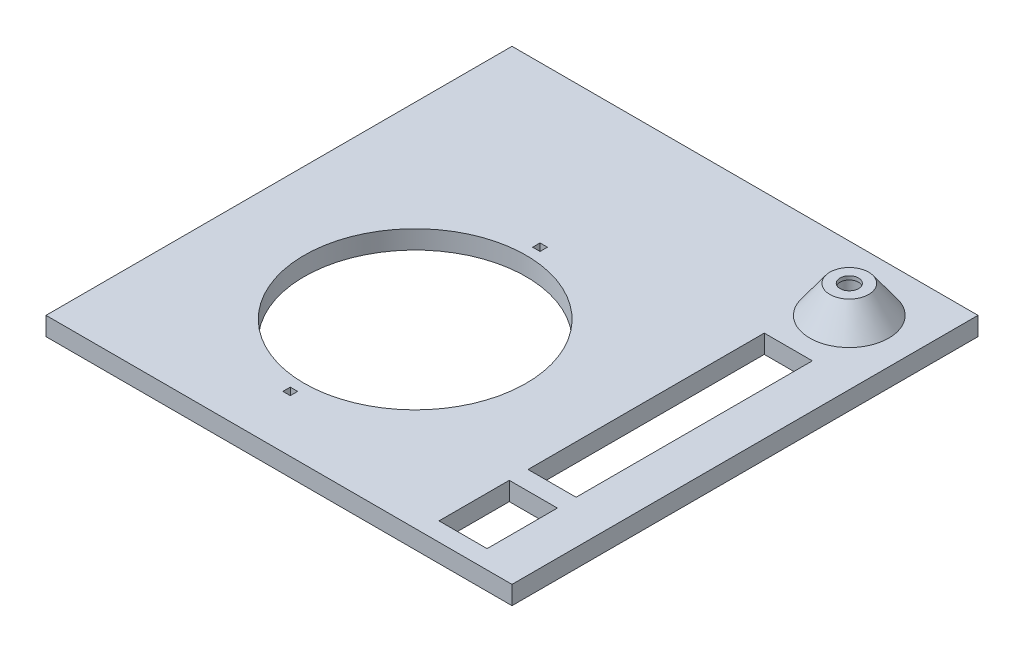
ISO-10303-21;
HEADER;
FILE_DESCRIPTION(('STEP AP214'),'2;1');
FILE_NAME('part.step','',(''),(''),'','','');
FILE_SCHEMA(('AUTOMOTIVE_DESIGN { 1 0 10303 214 1 1 1 1 }'));
ENDSEC;
DATA;
#1=APPLICATION_CONTEXT('core data for automotive mechanical design processes');
#2=APPLICATION_PROTOCOL_DEFINITION('international standard','automotive_design',2000,#1);
#3=PRODUCT_CONTEXT('',#1,'mechanical');
#4=PRODUCT('Part','Part','',(#3));
#5=PRODUCT_RELATED_PRODUCT_CATEGORY('part','',(#4));
#6=PRODUCT_DEFINITION_FORMATION('','',#4);
#7=PRODUCT_DEFINITION_CONTEXT('part definition',#1,'design');
#8=PRODUCT_DEFINITION('design','',#6,#7);
#9=PRODUCT_DEFINITION_SHAPE('','',#8);
#10=(LENGTH_UNIT() NAMED_UNIT(*) SI_UNIT(.MILLI.,.METRE.));
#11=(NAMED_UNIT(*) PLANE_ANGLE_UNIT() SI_UNIT($,.RADIAN.));
#12=(NAMED_UNIT(*) SI_UNIT($,.STERADIAN.) SOLID_ANGLE_UNIT());
#13=UNCERTAINTY_MEASURE_WITH_UNIT(LENGTH_MEASURE(1.E-05),#10,'distance_accuracy_value','');
#14=(GEOMETRIC_REPRESENTATION_CONTEXT(3) GLOBAL_UNCERTAINTY_ASSIGNED_CONTEXT((#13)) GLOBAL_UNIT_ASSIGNED_CONTEXT((#10,
#11,#12)) REPRESENTATION_CONTEXT('',''));
#15=CARTESIAN_POINT('',(0.,0.,0.));
#16=DIRECTION('',(0.,0.,1.));
#17=DIRECTION('',(1.,0.,0.));
#18=AXIS2_PLACEMENT_3D('',#15,#16,#17);
#19=CARTESIAN_POINT('',(0.,5.,0.));
#20=DIRECTION('',(0.,-1.,0.));
#21=DIRECTION('',(0.,0.,-1.));
#22=AXIS2_PLACEMENT_3D('',#19,#20,#21);
#23=PLANE('',#22);
#24=DIRECTION('',(1.,0.,0.));
#25=VECTOR('',#24,1.);
#26=CARTESIAN_POINT('',(51.8371550320844,5.,-81.7384677373599));
#27=LINE('',#26,#25);
#28=CARTESIAN_POINT('',(49.8371550320844,5.,-81.7384677373599));
#29=VERTEX_POINT('',#28);
#30=CARTESIAN_POINT('',(51.8371550320844,5.,-81.7384677373599));
#31=VERTEX_POINT('',#30);
#32=EDGE_CURVE('E207',#29,#31,#27,.T.);
#33=ORIENTED_EDGE('',*,*,#32,.F.);
#34=DIRECTION('',(0.,0.,1.));
#35=VECTOR('',#34,1.);
#36=CARTESIAN_POINT('',(49.8371550320844,5.,-83.7384677373599));
#37=LINE('',#36,#35);
#38=CARTESIAN_POINT('',(49.8371550320844,5.,-83.7384677373599));
#39=VERTEX_POINT('',#38);
#40=EDGE_CURVE('E56',#39,#29,#37,.T.);
#41=ORIENTED_EDGE('',*,*,#40,.F.);
#42=DIRECTION('',(-1.,0.,0.));
#43=VECTOR('',#42,1.);
#44=CARTESIAN_POINT('',(51.8371550320844,5.,-83.7384677373599));
#45=LINE('',#44,#43);
#46=CARTESIAN_POINT('',(51.8371550320844,5.,-83.7384677373599));
#47=VERTEX_POINT('',#46);
#48=EDGE_CURVE('E198',#47,#39,#45,.T.);
#49=ORIENTED_EDGE('',*,*,#48,.F.);
#50=DIRECTION('',(0.,0.,-1.));
#51=VECTOR('',#50,1.);
#52=CARTESIAN_POINT('',(51.8371550320844,5.,-83.7384677373599));
#53=LINE('',#52,#51);
#54=EDGE_CURVE('E201',#31,#47,#53,.T.);
#55=ORIENTED_EDGE('',*,*,#54,.F.);
#56=EDGE_LOOP('',(#33,#41,#49,#55));
#57=FACE_BOUND('',#56,.T.);
#58=DIRECTION('',(1.,0.,0.));
#59=VECTOR('',#58,1.);
#60=CARTESIAN_POINT('',(51.8371550320844,5.,-14.2107002400342));
#61=LINE('',#60,#59);
#62=CARTESIAN_POINT('',(49.8371550320844,5.,-14.2107002400342));
#63=VERTEX_POINT('',#62);
#64=CARTESIAN_POINT('',(51.8371550320844,5.,-14.2107002400342));
#65=VERTEX_POINT('',#64);
#66=EDGE_CURVE('E233',#63,#65,#61,.T.);
#67=ORIENTED_EDGE('',*,*,#66,.F.);
#68=DIRECTION('',(0.,0.,1.));
#69=VECTOR('',#68,1.);
#70=CARTESIAN_POINT('',(49.8371550320844,5.,-14.2107002400342));
#71=LINE('',#70,#69);
#72=CARTESIAN_POINT('',(49.8371550320844,5.,-16.2107002400342));
#73=VERTEX_POINT('',#72);
#74=EDGE_CURVE('E64',#73,#63,#71,.T.);
#75=ORIENTED_EDGE('',*,*,#74,.F.);
#76=DIRECTION('',(-1.,0.,0.));
#77=VECTOR('',#76,1.);
#78=CARTESIAN_POINT('',(51.8371550320844,5.,-16.2107002400342));
#79=LINE('',#78,#77);
#80=CARTESIAN_POINT('',(51.8371550320844,5.,-16.2107002400342));
#81=VERTEX_POINT('',#80);
#82=EDGE_CURVE('E222',#81,#73,#79,.T.);
#83=ORIENTED_EDGE('',*,*,#82,.F.);
#84=DIRECTION('',(0.,0.,-1.));
#85=VECTOR('',#84,1.);
#86=CARTESIAN_POINT('',(51.8371550320844,5.,-14.2107002400342));
#87=LINE('',#86,#85);
#88=EDGE_CURVE('E236',#65,#81,#87,.T.);
#89=ORIENTED_EDGE('',*,*,#88,.F.);
#90=EDGE_LOOP('',(#67,#75,#83,#89));
#91=FACE_BOUND('',#90,.T.);
#92=CARTESIAN_POINT('',(50.8371550320844,5.,-48.9745839886971));
#93=DIRECTION('',(0.,1.,0.));
#94=DIRECTION('',(0.,0.,1.));
#95=AXIS2_PLACEMENT_3D('',#92,#93,#94);
#96=CIRCLE('',#95,30.);
#97=CARTESIAN_POINT('',(50.8371550320844,5.,-18.9745839886971));
#98=VERTEX_POINT('',#97);
#99=EDGE_CURVE('E214',#98,#98,#96,.T.);
#100=ORIENTED_EDGE('',*,*,#99,.F.);
#101=EDGE_LOOP('',(#100));
#102=FACE_BOUND('',#101,.T.);
#103=DIRECTION('',(0.,0.,1.));
#104=VECTOR('',#103,1.);
#105=CARTESIAN_POINT('',(0.,5.,0.));
#106=LINE('',#105,#104);
#107=CARTESIAN_POINT('',(0.,5.,-126.));
#108=VERTEX_POINT('',#107);
#109=CARTESIAN_POINT('',(0.,5.,0.));
#110=VERTEX_POINT('',#109);
#111=EDGE_CURVE('E325',#108,#110,#106,.T.);
#112=ORIENTED_EDGE('',*,*,#111,.T.);
#113=DIRECTION('',(1.,0.,0.));
#114=VECTOR('',#113,1.);
#115=CARTESIAN_POINT('',(0.,5.,0.));
#116=LINE('',#115,#114);
#117=CARTESIAN_POINT('',(126.,5.,0.));
#118=VERTEX_POINT('',#117);
#119=EDGE_CURVE('E328',#110,#118,#116,.T.);
#120=ORIENTED_EDGE('',*,*,#119,.T.);
#121=DIRECTION('',(0.,0.,-1.));
#122=VECTOR('',#121,1.);
#123=CARTESIAN_POINT('',(126.,5.,0.));
#124=LINE('',#123,#122);
#125=CARTESIAN_POINT('',(126.,5.,-126.));
#126=VERTEX_POINT('',#125);
#127=EDGE_CURVE('E331',#118,#126,#124,.T.);
#128=ORIENTED_EDGE('',*,*,#127,.T.);
#129=DIRECTION('',(-1.,0.,0.));
#130=VECTOR('',#129,1.);
#131=CARTESIAN_POINT('',(0.,5.,-126.));
#132=LINE('',#131,#130);
#133=EDGE_CURVE('E333',#126,#108,#132,.T.);
#134=ORIENTED_EDGE('',*,*,#133,.T.);
#135=EDGE_LOOP('',(#112,#120,#128,#134));
#136=FACE_BOUND('',#135,.T.);
#137=CARTESIAN_POINT('',(108.6,5.,-108.6));
#138=DIRECTION('',(0.,-1.,0.));
#139=DIRECTION('',(0.,0.,-1.));
#140=AXIS2_PLACEMENT_3D('',#137,#138,#139);
#141=CIRCLE('',#140,10.6836436799865);
#142=CARTESIAN_POINT('',(108.6,5.,-119.283643679987));
#143=VERTEX_POINT('',#142);
#144=EDGE_CURVE('E11',#143,#143,#141,.T.);
#145=ORIENTED_EDGE('',*,*,#144,.T.);
#146=EDGE_LOOP('',(#145));
#147=FACE_BOUND('',#146,.T.);
#148=DIRECTION('',(0.,0.,1.));
#149=VECTOR('',#148,1.);
#150=CARTESIAN_POINT('',(101.263328315795,5.,0.));
#151=LINE('',#150,#149);
#152=CARTESIAN_POINT('',(101.263328315795,5.,-24.));
#153=VERTEX_POINT('',#152);
#154=CARTESIAN_POINT('',(101.263328315795,5.,-5.));
#155=VERTEX_POINT('',#154);
#156=EDGE_CURVE('E300',#153,#155,#151,.T.);
#157=ORIENTED_EDGE('',*,*,#156,.F.);
#158=DIRECTION('',(-1.,0.,0.));
#159=VECTOR('',#158,1.);
#160=CARTESIAN_POINT('',(0.,5.,-24.));
#161=LINE('',#160,#159);
#162=CARTESIAN_POINT('',(114.263328315795,5.,-24.));
#163=VERTEX_POINT('',#162);
#164=EDGE_CURVE('E250',#163,#153,#161,.T.);
#165=ORIENTED_EDGE('',*,*,#164,.F.);
#166=DIRECTION('',(0.,0.,1.));
#167=VECTOR('',#166,1.);
#168=CARTESIAN_POINT('',(114.263328315795,5.,0.));
#169=LINE('',#168,#167);
#170=CARTESIAN_POINT('',(114.263328315795,5.,-5.));
#171=VERTEX_POINT('',#170);
#172=EDGE_CURVE('E290',#163,#171,#169,.T.);
#173=ORIENTED_EDGE('',*,*,#172,.T.);
#174=DIRECTION('',(-1.,0.,0.));
#175=VECTOR('',#174,1.);
#176=CARTESIAN_POINT('',(0.,5.,-4.99999999999999));
#177=LINE('',#176,#175);
#178=EDGE_CURVE('E303',#171,#155,#177,.T.);
#179=ORIENTED_EDGE('',*,*,#178,.T.);
#180=EDGE_LOOP('',(#157,#165,#173,#179));
#181=FACE_BOUND('',#180,.T.);
#182=DIRECTION('',(0.,0.,-1.));
#183=VECTOR('',#182,1.);
#184=CARTESIAN_POINT('',(101.263328315795,5.,0.));
#185=LINE('',#184,#183);
#186=CARTESIAN_POINT('',(101.263328315795,5.,-29.06949502318));
#187=VERTEX_POINT('',#186);
#188=CARTESIAN_POINT('',(101.263328315795,5.,-92.9491679773942));
#189=VERTEX_POINT('',#188);
#190=EDGE_CURVE('E265',#187,#189,#185,.T.);
#191=ORIENTED_EDGE('',*,*,#190,.T.);
#192=DIRECTION('',(-1.,0.,0.));
#193=VECTOR('',#192,1.);
#194=CARTESIAN_POINT('',(0.,5.,-92.9491679773942));
#195=LINE('',#194,#193);
#196=CARTESIAN_POINT('',(114.263328315795,5.,-92.9491679773942));
#197=VERTEX_POINT('',#196);
#198=EDGE_CURVE('E256',#197,#189,#195,.T.);
#199=ORIENTED_EDGE('',*,*,#198,.F.);
#200=DIRECTION('',(0.,0.,-1.));
#201=VECTOR('',#200,1.);
#202=CARTESIAN_POINT('',(114.263328315795,5.,0.));
#203=LINE('',#202,#201);
#204=CARTESIAN_POINT('',(114.263328315795,5.,-29.06949502318));
#205=VERTEX_POINT('',#204);
#206=EDGE_CURVE('E272',#205,#197,#203,.T.);
#207=ORIENTED_EDGE('',*,*,#206,.F.);
#208=DIRECTION('',(-1.,0.,0.));
#209=VECTOR('',#208,1.);
#210=CARTESIAN_POINT('',(0.,5.,-29.06949502318));
#211=LINE('',#210,#209);
#212=EDGE_CURVE('E268',#205,#187,#211,.T.);
#213=ORIENTED_EDGE('',*,*,#212,.T.);
#214=EDGE_LOOP('',(#191,#199,#207,#213));
#215=FACE_BOUND('',#214,.T.);
#216=ADVANCED_FACE('F40',(#57,#91,#102,#136,#147,#181,#215),#23,.F.);
#217=CARTESIAN_POINT('',(0.,0.,0.));
#218=DIRECTION('',(0.,-1.,0.));
#219=DIRECTION('',(0.,0.,-1.));
#220=AXIS2_PLACEMENT_3D('',#217,#218,#219);
#221=PLANE('',#220);
#222=CARTESIAN_POINT('',(50.8371550320844,0.,-48.9745839886971));
#223=DIRECTION('',(0.,1.,0.));
#224=DIRECTION('',(0.,0.,1.));
#225=AXIS2_PLACEMENT_3D('',#222,#223,#224);
#226=CIRCLE('',#225,30.);
#227=CARTESIAN_POINT('',(50.8371550320844,0.,-18.9745839886971));
#228=VERTEX_POINT('',#227);
#229=EDGE_CURVE('E247',#228,#228,#226,.T.);
#230=ORIENTED_EDGE('',*,*,#229,.T.);
#231=EDGE_LOOP('',(#230));
#232=FACE_BOUND('',#231,.T.);
#233=DIRECTION('',(-1.,0.,0.));
#234=VECTOR('',#233,1.);
#235=CARTESIAN_POINT('',(0.,0.,-24.));
#236=LINE('',#235,#234);
#237=CARTESIAN_POINT('',(114.263328315795,0.,-24.));
#238=VERTEX_POINT('',#237);
#239=CARTESIAN_POINT('',(101.263328315795,0.,-24.));
#240=VERTEX_POINT('',#239);
#241=EDGE_CURVE('E286',#238,#240,#236,.T.);
#242=ORIENTED_EDGE('',*,*,#241,.T.);
#243=DIRECTION('',(0.,0.,1.));
#244=VECTOR('',#243,1.);
#245=CARTESIAN_POINT('',(101.263328315795,0.,0.));
#246=LINE('',#245,#244);
#247=CARTESIAN_POINT('',(101.263328315795,0.,-5.));
#248=VERTEX_POINT('',#247);
#249=EDGE_CURVE('E289',#240,#248,#246,.T.);
#250=ORIENTED_EDGE('',*,*,#249,.T.);
#251=DIRECTION('',(-1.,0.,0.));
#252=VECTOR('',#251,1.);
#253=CARTESIAN_POINT('',(0.,0.,-4.99999999999999));
#254=LINE('',#253,#252);
#255=CARTESIAN_POINT('',(114.263328315795,0.,-5.));
#256=VERTEX_POINT('',#255);
#257=EDGE_CURVE('E293',#256,#248,#254,.T.);
#258=ORIENTED_EDGE('',*,*,#257,.F.);
#259=DIRECTION('',(0.,0.,1.));
#260=VECTOR('',#259,1.);
#261=CARTESIAN_POINT('',(114.263328315795,0.,0.));
#262=LINE('',#261,#260);
#263=EDGE_CURVE('E296',#238,#256,#262,.T.);
#264=ORIENTED_EDGE('',*,*,#263,.F.);
#265=EDGE_LOOP('',(#242,#250,#258,#264));
#266=FACE_BOUND('',#265,.T.);
#267=CARTESIAN_POINT('',(108.6,0.,-108.6));
#268=DIRECTION('',(0.,-1.,0.));
#269=DIRECTION('',(0.,0.,-1.));
#270=AXIS2_PLACEMENT_3D('',#267,#268,#269);
#271=CIRCLE('',#270,2.95);
#272=CARTESIAN_POINT('',(108.6,0.,-111.55));
#273=VERTEX_POINT('',#272);
#274=EDGE_CURVE('E322',#273,#273,#271,.T.);
#275=ORIENTED_EDGE('',*,*,#274,.F.);
#276=EDGE_LOOP('',(#275));
#277=FACE_BOUND('',#276,.T.);
#278=DIRECTION('',(0.,0.,1.));
#279=VECTOR('',#278,1.);
#280=CARTESIAN_POINT('',(0.,0.,0.));
#281=LINE('',#280,#279);
#282=CARTESIAN_POINT('',(0.,0.,-126.));
#283=VERTEX_POINT('',#282);
#284=CARTESIAN_POINT('',(0.,0.,0.));
#285=VERTEX_POINT('',#284);
#286=EDGE_CURVE('E321',#283,#285,#281,.T.);
#287=ORIENTED_EDGE('',*,*,#286,.F.);
#288=DIRECTION('',(-1.,0.,0.));
#289=VECTOR('',#288,1.);
#290=CARTESIAN_POINT('',(0.,0.,-126.));
#291=LINE('',#290,#289);
#292=CARTESIAN_POINT('',(126.,0.,-126.));
#293=VERTEX_POINT('',#292);
#294=EDGE_CURVE('E329',#293,#283,#291,.T.);
#295=ORIENTED_EDGE('',*,*,#294,.F.);
#296=DIRECTION('',(0.,0.,-1.));
#297=VECTOR('',#296,1.);
#298=CARTESIAN_POINT('',(126.,0.,0.));
#299=LINE('',#298,#297);
#300=CARTESIAN_POINT('',(126.,0.,0.));
#301=VERTEX_POINT('',#300);
#302=EDGE_CURVE('E340',#301,#293,#299,.T.);
#303=ORIENTED_EDGE('',*,*,#302,.F.);
#304=DIRECTION('',(1.,0.,0.));
#305=VECTOR('',#304,1.);
#306=CARTESIAN_POINT('',(0.,0.,0.));
#307=LINE('',#306,#305);
#308=EDGE_CURVE('E338',#285,#301,#307,.T.);
#309=ORIENTED_EDGE('',*,*,#308,.F.);
#310=EDGE_LOOP('',(#287,#295,#303,#309));
#311=FACE_BOUND('',#310,.T.);
#312=DIRECTION('',(-1.,0.,0.));
#313=VECTOR('',#312,1.);
#314=CARTESIAN_POINT('',(0.,0.,-92.9491679773942));
#315=LINE('',#314,#313);
#316=CARTESIAN_POINT('',(114.263328315795,0.,-92.9491679773942));
#317=VERTEX_POINT('',#316);
#318=CARTESIAN_POINT('',(101.263328315795,0.,-92.9491679773942));
#319=VERTEX_POINT('',#318);
#320=EDGE_CURVE('E261',#317,#319,#315,.T.);
#321=ORIENTED_EDGE('',*,*,#320,.T.);
#322=DIRECTION('',(0.,0.,-1.));
#323=VECTOR('',#322,1.);
#324=CARTESIAN_POINT('',(101.263328315795,0.,0.));
#325=LINE('',#324,#323);
#326=CARTESIAN_POINT('',(101.263328315795,0.,-29.06949502318));
#327=VERTEX_POINT('',#326);
#328=EDGE_CURVE('E253',#327,#319,#325,.T.);
#329=ORIENTED_EDGE('',*,*,#328,.F.);
#330=DIRECTION('',(-1.,0.,0.));
#331=VECTOR('',#330,1.);
#332=CARTESIAN_POINT('',(0.,0.,-29.06949502318));
#333=LINE('',#332,#331);
#334=CARTESIAN_POINT('',(114.263328315795,0.,-29.06949502318));
#335=VERTEX_POINT('',#334);
#336=EDGE_CURVE('E255',#335,#327,#333,.T.);
#337=ORIENTED_EDGE('',*,*,#336,.F.);
#338=DIRECTION('',(0.,0.,-1.));
#339=VECTOR('',#338,1.);
#340=CARTESIAN_POINT('',(114.263328315795,0.,0.));
#341=LINE('',#340,#339);
#342=EDGE_CURVE('E258',#335,#317,#341,.T.);
#343=ORIENTED_EDGE('',*,*,#342,.T.);
#344=EDGE_LOOP('',(#321,#329,#337,#343));
#345=FACE_BOUND('',#344,.T.);
#346=ADVANCED_FACE('F378',(#232,#266,#277,#311,#345),#221,.T.);
#347=CARTESIAN_POINT('',(0.,5.,0.));
#348=DIRECTION('',(1.,0.,0.));
#349=DIRECTION('',(0.,0.,-1.));
#350=AXIS2_PLACEMENT_3D('',#347,#348,#349);
#351=PLANE('',#350);
#352=ORIENTED_EDGE('',*,*,#286,.T.);
#353=DIRECTION('',(0.,-1.,0.));
#354=VECTOR('',#353,1.);
#355=CARTESIAN_POINT('',(0.,5.,0.));
#356=LINE('',#355,#354);
#357=EDGE_CURVE('E351',#110,#285,#356,.T.);
#358=ORIENTED_EDGE('',*,*,#357,.F.);
#359=ORIENTED_EDGE('',*,*,#111,.F.);
#360=DIRECTION('',(0.,-1.,0.));
#361=VECTOR('',#360,1.);
#362=CARTESIAN_POINT('',(0.,5.,-126.));
#363=LINE('',#362,#361);
#364=EDGE_CURVE('E335',#108,#283,#363,.T.);
#365=ORIENTED_EDGE('',*,*,#364,.T.);
#366=EDGE_LOOP('',(#352,#358,#359,#365));
#367=FACE_BOUND('',#366,.T.);
#368=ADVANCED_FACE('F386',(#367),#351,.F.);
#369=CARTESIAN_POINT('',(0.,5.,0.));
#370=DIRECTION('',(0.,0.,-1.));
#371=DIRECTION('',(-1.,0.,0.));
#372=AXIS2_PLACEMENT_3D('',#369,#370,#371);
#373=PLANE('',#372);
#374=ORIENTED_EDGE('',*,*,#308,.T.);
#375=DIRECTION('',(0.,-1.,0.));
#376=VECTOR('',#375,1.);
#377=CARTESIAN_POINT('',(126.,5.,0.));
#378=LINE('',#377,#376);
#379=EDGE_CURVE('E348',#118,#301,#378,.T.);
#380=ORIENTED_EDGE('',*,*,#379,.F.);
#381=ORIENTED_EDGE('',*,*,#119,.F.);
#382=ORIENTED_EDGE('',*,*,#357,.T.);
#383=EDGE_LOOP('',(#374,#380,#381,#382));
#384=FACE_BOUND('',#383,.T.);
#385=ADVANCED_FACE('F400',(#384),#373,.F.);
#386=CARTESIAN_POINT('',(126.,5.,0.));
#387=DIRECTION('',(-1.,0.,0.));
#388=DIRECTION('',(0.,0.,1.));
#389=AXIS2_PLACEMENT_3D('',#386,#387,#388);
#390=PLANE('',#389);
#391=ORIENTED_EDGE('',*,*,#302,.T.);
#392=DIRECTION('',(0.,-1.,0.));
#393=VECTOR('',#392,1.);
#394=CARTESIAN_POINT('',(126.,5.,-126.));
#395=LINE('',#394,#393);
#396=EDGE_CURVE('E345',#126,#293,#395,.T.);
#397=ORIENTED_EDGE('',*,*,#396,.F.);
#398=ORIENTED_EDGE('',*,*,#127,.F.);
#399=ORIENTED_EDGE('',*,*,#379,.T.);
#400=EDGE_LOOP('',(#391,#397,#398,#399));
#401=FACE_BOUND('',#400,.T.);
#402=ADVANCED_FACE('F396',(#401),#390,.F.);
#403=CARTESIAN_POINT('',(0.,5.,-126.));
#404=DIRECTION('',(0.,0.,1.));
#405=DIRECTION('',(1.,0.,0.));
#406=AXIS2_PLACEMENT_3D('',#403,#404,#405);
#407=PLANE('',#406);
#408=ORIENTED_EDGE('',*,*,#294,.T.);
#409=ORIENTED_EDGE('',*,*,#364,.F.);
#410=ORIENTED_EDGE('',*,*,#133,.F.);
#411=ORIENTED_EDGE('',*,*,#396,.T.);
#412=EDGE_LOOP('',(#408,#409,#410,#411));
#413=FACE_BOUND('',#412,.T.);
#414=ADVANCED_FACE('F393',(#413),#407,.F.);
#415=CARTESIAN_POINT('',(108.6,12.5,-108.6));
#416=DIRECTION('',(0.,1.,0.));
#417=DIRECTION('',(0.,0.,1.));
#418=AXIS2_PLACEMENT_3D('',#415,#416,#417);
#419=PLANE('',#418);
#420=CARTESIAN_POINT('',(108.6,12.5,-108.6));
#421=DIRECTION('',(0.,1.,0.));
#422=DIRECTION('',(0.,0.,1.));
#423=AXIS2_PLACEMENT_3D('',#420,#421,#422);
#424=CIRCLE('',#423,5.23457471994626);
#425=CARTESIAN_POINT('',(108.6,12.5,-113.834574719946));
#426=VERTEX_POINT('',#425);
#427=EDGE_CURVE('E49',#426,#426,#424,.T.);
#428=ORIENTED_EDGE('',*,*,#427,.T.);
#429=EDGE_LOOP('',(#428));
#430=FACE_BOUND('',#429,.T.);
#431=CARTESIAN_POINT('',(108.6,12.5,-108.6));
#432=DIRECTION('',(0.,1.,0.));
#433=DIRECTION('',(0.,0.,1.));
#434=AXIS2_PLACEMENT_3D('',#431,#432,#433);
#435=CIRCLE('',#434,2.5);
#436=CARTESIAN_POINT('',(108.6,12.5,-106.1));
#437=VERTEX_POINT('',#436);
#438=EDGE_CURVE('E279',#437,#437,#435,.T.);
#439=ORIENTED_EDGE('',*,*,#438,.F.);
#440=EDGE_LOOP('',(#439));
#441=FACE_BOUND('',#440,.T.);
#442=ADVANCED_FACE('F358',(#430,#441),#419,.T.);
#443=CARTESIAN_POINT('',(108.6,11.5,-108.6));
#444=DIRECTION('',(0.,-1.,0.));
#445=DIRECTION('',(0.,0.,-1.));
#446=AXIS2_PLACEMENT_3D('',#443,#444,#445);
#447=CYLINDRICAL_SURFACE('',#446,2.95);
#448=CARTESIAN_POINT('',(108.6,11.5,-108.6));
#449=DIRECTION('',(0.,-1.,0.));
#450=DIRECTION('',(0.,0.,-1.));
#451=AXIS2_PLACEMENT_3D('',#448,#449,#450);
#452=CIRCLE('',#451,2.95);
#453=CARTESIAN_POINT('',(108.6,11.5,-111.55));
#454=VERTEX_POINT('',#453);
#455=EDGE_CURVE('E318',#454,#454,#452,.T.);
#456=ORIENTED_EDGE('',*,*,#455,.F.);
#457=EDGE_LOOP('',(#456));
#458=FACE_BOUND('',#457,.T.);
#459=ORIENTED_EDGE('',*,*,#274,.T.);
#460=EDGE_LOOP('',(#459));
#461=FACE_BOUND('',#460,.T.);
#462=ADVANCED_FACE('F468',(#458,#461),#447,.F.);
#463=CARTESIAN_POINT('',(108.6,11.5,-108.6));
#464=DIRECTION('',(0.,-1.,0.));
#465=DIRECTION('',(0.,0.,-1.));
#466=AXIS2_PLACEMENT_3D('',#463,#464,#465);
#467=PLANE('',#466);
#468=CARTESIAN_POINT('',(108.6,11.5,-108.6));
#469=DIRECTION('',(0.,-1.,0.));
#470=DIRECTION('',(0.,0.,-1.));
#471=AXIS2_PLACEMENT_3D('',#468,#469,#470);
#472=CIRCLE('',#471,2.5);
#473=CARTESIAN_POINT('',(108.6,11.5,-111.1));
#474=VERTEX_POINT('',#473);
#475=EDGE_CURVE('E317',#474,#474,#472,.T.);
#476=ORIENTED_EDGE('',*,*,#475,.F.);
#477=EDGE_LOOP('',(#476));
#478=FACE_BOUND('',#477,.T.);
#479=ORIENTED_EDGE('',*,*,#455,.T.);
#480=EDGE_LOOP('',(#479));
#481=FACE_BOUND('',#480,.T.);
#482=ADVANCED_FACE('F373',(#478,#481),#467,.T.);
#483=CARTESIAN_POINT('',(108.6,0.,-108.6));
#484=DIRECTION('',(0.,1.,0.));
#485=DIRECTION('',(0.,0.,1.));
#486=AXIS2_PLACEMENT_3D('',#483,#484,#485);
#487=CYLINDRICAL_SURFACE('',#486,2.5);
#488=ORIENTED_EDGE('',*,*,#475,.T.);
#489=EDGE_LOOP('',(#488));
#490=FACE_BOUND('',#489,.T.);
#491=ORIENTED_EDGE('',*,*,#438,.T.);
#492=EDGE_LOOP('',(#491));
#493=FACE_BOUND('',#492,.T.);
#494=ADVANCED_FACE('F363',(#490,#493),#487,.F.);
#495=CARTESIAN_POINT('',(108.6,12.5,-108.6));
#496=DIRECTION('',(0.,-1.,0.));
#497=DIRECTION('',(0.,0.,-1.));
#498=AXIS2_PLACEMENT_3D('',#495,#496,#497);
#499=CONICAL_SURFACE('',#498,5.23457471994626,0.628318530717965);
#500=CARTESIAN_POINT('',(108.6,5.,-119.283643679987));
#501=CARTESIAN_POINT('',(108.6,5.078125,-119.226882544986));
#502=CARTESIAN_POINT('',(108.6,5.15625,-119.170121409986));
#503=CARTESIAN_POINT('',(108.6,5.3125,-119.056599139985));
#504=CARTESIAN_POINT('',(108.6,5.390625,-118.999838004984));
#505=CARTESIAN_POINT('',(108.6,5.546875,-118.886315734984));
#506=CARTESIAN_POINT('',(108.6,5.625,-118.829554599983));
#507=CARTESIAN_POINT('',(108.6,5.78125,-118.716032329982));
#508=CARTESIAN_POINT('',(108.6,5.859375,-118.659271194982));
#509=CARTESIAN_POINT('',(108.6,6.015625,-118.545748924981));
#510=CARTESIAN_POINT('',(108.6,6.09375,-118.488987789981));
#511=CARTESIAN_POINT('',(108.6,6.25,-118.37546551998));
#512=CARTESIAN_POINT('',(108.6,6.328125,-118.318704384979));
#513=CARTESIAN_POINT('',(108.6,6.484375,-118.205182114979));
#514=CARTESIAN_POINT('',(108.6,6.5625,-118.148420979978));
#515=CARTESIAN_POINT('',(108.6,6.71875,-118.034898709977));
#516=CARTESIAN_POINT('',(108.6,6.796875,-117.978137574977));
#517=CARTESIAN_POINT('',(108.6,6.953125,-117.864615304976));
#518=CARTESIAN_POINT('',(108.6,7.03125,-117.807854169976));
#519=CARTESIAN_POINT('',(108.6,7.1875,-117.694331899975));
#520=CARTESIAN_POINT('',(108.6,7.265625,-117.637570764974));
#521=CARTESIAN_POINT('',(108.6,7.421875,-117.524048494974));
#522=CARTESIAN_POINT('',(108.6,7.5,-117.467287359973));
#523=CARTESIAN_POINT('',(108.6,7.65625,-117.353765089972));
#524=CARTESIAN_POINT('',(108.6,7.734375,-117.297003954972));
#525=CARTESIAN_POINT('',(108.6,7.890625,-117.183481684971));
#526=CARTESIAN_POINT('',(108.6,7.96875,-117.126720549971));
#527=CARTESIAN_POINT('',(108.6,8.125,-117.01319827997));
#528=CARTESIAN_POINT('',(108.6,8.203125,-116.956437144969));
#529=CARTESIAN_POINT('',(108.6,8.359375,-116.842914874968));
#530=CARTESIAN_POINT('',(108.6,8.4375,-116.786153739968));
#531=CARTESIAN_POINT('',(108.6,8.59375,-116.672631469967));
#532=CARTESIAN_POINT('',(108.6,8.671875,-116.615870334967));
#533=CARTESIAN_POINT('',(108.6,8.828125,-116.502348064966));
#534=CARTESIAN_POINT('',(108.6,8.90625,-116.445586929966));
#535=CARTESIAN_POINT('',(108.6,9.0625,-116.332064659965));
#536=CARTESIAN_POINT('',(108.6,9.140625,-116.275303524964));
#537=CARTESIAN_POINT('',(108.6,9.296875,-116.161781254963));
#538=CARTESIAN_POINT('',(108.6,9.375,-116.105020119963));
#539=CARTESIAN_POINT('',(108.6,9.53125,-115.991497849962));
#540=CARTESIAN_POINT('',(108.6,9.609375,-115.934736714962));
#541=CARTESIAN_POINT('',(108.6,9.765625,-115.821214444961));
#542=CARTESIAN_POINT('',(108.6,9.84375,-115.764453309961));
#543=CARTESIAN_POINT('',(108.6,10.,-115.65093103996));
#544=CARTESIAN_POINT('',(108.6,10.078125,-115.594169904959));
#545=CARTESIAN_POINT('',(108.6,10.234375,-115.480647634958));
#546=CARTESIAN_POINT('',(108.6,10.3125,-115.423886499958));
#547=CARTESIAN_POINT('',(108.6,10.46875,-115.310364229957));
#548=CARTESIAN_POINT('',(108.6,10.546875,-115.253603094957));
#549=CARTESIAN_POINT('',(108.6,10.703125,-115.140080824956));
#550=CARTESIAN_POINT('',(108.6,10.78125,-115.083319689955));
#551=CARTESIAN_POINT('',(108.6,10.9375,-114.969797419955));
#552=CARTESIAN_POINT('',(108.6,11.015625,-114.913036284954));
#553=CARTESIAN_POINT('',(108.6,11.171875,-114.799514014953));
#554=CARTESIAN_POINT('',(108.6,11.25,-114.742752879953));
#555=CARTESIAN_POINT('',(108.6,11.40625,-114.629230609952));
#556=CARTESIAN_POINT('',(108.6,11.484375,-114.572469474952));
#557=CARTESIAN_POINT('',(108.6,11.640625,-114.458947204951));
#558=CARTESIAN_POINT('',(108.6,11.71875,-114.40218606995));
#559=CARTESIAN_POINT('',(108.6,11.875,-114.28866379995));
#560=CARTESIAN_POINT('',(108.6,11.953125,-114.231902664949));
#561=CARTESIAN_POINT('',(108.6,12.109375,-114.118380394948));
#562=CARTESIAN_POINT('',(108.6,12.1875,-114.061619259948));
#563=CARTESIAN_POINT('',(108.6,12.34375,-113.948096989947));
#564=CARTESIAN_POINT('',(108.6,12.421875,-113.891335854947));
#565=CARTESIAN_POINT('',(108.6,12.5,-113.834574719946));
#566=B_SPLINE_CURVE_WITH_KNOTS('',3,(#500,#501,#502,#503,#504,#505,#506,#507,#508,#509,#510,
#511,#512,#513,#514,#515,#516,#517,#518,#519,#520,#521,#522,#523,#524,#525,#526,#527,#528,#529,
#530,#531,#532,#533,#534,#535,#536,#537,#538,#539,#540,#541,#542,#543,#544,#545,#546,#547,#548,
#549,#550,#551,#552,#553,#554,#555,#556,#557,#558,#559,#560,#561,#562,#563,#564,#565),
.UNSPECIFIED.,.F.,.F.,(4,2,2,2,2,2,2,2,2,2,2,2,2,2,2,2,2,2,2,2,2,2,2,2,2,2,2,2,2,2,2,2,4),(0.,
0.289703432226508,0.579406864453025,0.869110296679541,1.15881372890605,1.44851716113257,
1.73822059335908,2.0279240255856,2.31762745781211,2.60733089003862,2.89703432226514,
3.18673775449166,3.47644118671817,3.76614461894468,4.0558480511712,4.34555148339771,
4.63525491562423,4.92495834785074,5.21466178007725,5.50436521230377,5.79406864453029,
6.0837720767568,6.37347550898331,6.66317894120983,6.95288237343634,7.24258580566286,
7.53228923788937,7.82199267011588,8.1116961023424,8.40139953456892,8.69110296679543,
8.98080639902195,9.27050983124846),.UNSPECIFIED.);
#567=EDGE_CURVE('BSEAM43',#143,#426,#566,.T.);
#568=ORIENTED_EDGE('',*,*,#144,.F.);
#569=ORIENTED_EDGE('',*,*,#427,.F.);
#570=ORIENTED_EDGE('',*,*,#567,.T.);
#571=ORIENTED_EDGE('',*,*,#567,.F.);
#572=EDGE_LOOP('',(#568,#570,#569,#571));
#573=FACE_BOUND('',#572,.T.);
#574=ADVANCED_FACE('F43',(#573),#499,.T.);
#575=CARTESIAN_POINT('',(0.,0.,-24.));
#576=DIRECTION('',(0.,0.,-1.));
#577=DIRECTION('',(-1.,0.,0.));
#578=AXIS2_PLACEMENT_3D('',#575,#576,#577);
#579=PLANE('',#578);
#580=ORIENTED_EDGE('',*,*,#164,.T.);
#581=DIRECTION('',(0.,1.,0.));
#582=VECTOR('',#581,1.);
#583=CARTESIAN_POINT('',(101.263328315795,0.,-24.));
#584=LINE('',#583,#582);
#585=EDGE_CURVE('E298',#240,#153,#584,.T.);
#586=ORIENTED_EDGE('',*,*,#585,.F.);
#587=ORIENTED_EDGE('',*,*,#241,.F.);
#588=DIRECTION('',(0.,1.,0.));
#589=VECTOR('',#588,1.);
#590=CARTESIAN_POINT('',(114.263328315795,0.,-24.));
#591=LINE('',#590,#589);
#592=EDGE_CURVE('E269',#238,#163,#591,.T.);
#593=ORIENTED_EDGE('',*,*,#592,.T.);
#594=EDGE_LOOP('',(#580,#586,#587,#593));
#595=FACE_BOUND('',#594,.T.);
#596=ADVANCED_FACE('F362',(#595),#579,.F.);
#597=CARTESIAN_POINT('',(114.263328315795,0.,0.));
#598=DIRECTION('',(-1.,0.,0.));
#599=DIRECTION('',(0.,0.,1.));
#600=AXIS2_PLACEMENT_3D('',#597,#598,#599);
#601=PLANE('',#600);
#602=ORIENTED_EDGE('',*,*,#172,.F.);
#603=ORIENTED_EDGE('',*,*,#592,.F.);
#604=ORIENTED_EDGE('',*,*,#263,.T.);
#605=DIRECTION('',(0.,1.,0.));
#606=VECTOR('',#605,1.);
#607=CARTESIAN_POINT('',(114.263328315795,0.,-5.));
#608=LINE('',#607,#606);
#609=EDGE_CURVE('E309',#256,#171,#608,.T.);
#610=ORIENTED_EDGE('',*,*,#609,.T.);
#611=EDGE_LOOP('',(#602,#603,#604,#610));
#612=FACE_BOUND('',#611,.T.);
#613=ADVANCED_FACE('F370',(#612),#601,.T.);
#614=CARTESIAN_POINT('',(0.,0.,-4.99999999999999));
#615=DIRECTION('',(0.,0.,-1.));
#616=DIRECTION('',(-1.,0.,0.));
#617=AXIS2_PLACEMENT_3D('',#614,#615,#616);
#618=PLANE('',#617);
#619=ORIENTED_EDGE('',*,*,#178,.F.);
#620=ORIENTED_EDGE('',*,*,#609,.F.);
#621=ORIENTED_EDGE('',*,*,#257,.T.);
#622=DIRECTION('',(0.,1.,0.));
#623=VECTOR('',#622,1.);
#624=CARTESIAN_POINT('',(101.263328315795,0.,-5.));
#625=LINE('',#624,#623);
#626=EDGE_CURVE('E311',#248,#155,#625,.T.);
#627=ORIENTED_EDGE('',*,*,#626,.T.);
#628=EDGE_LOOP('',(#619,#620,#621,#627));
#629=FACE_BOUND('',#628,.T.);
#630=ADVANCED_FACE('F459',(#629),#618,.T.);
#631=CARTESIAN_POINT('',(101.263328315795,0.,0.));
#632=DIRECTION('',(-1.,0.,0.));
#633=DIRECTION('',(0.,0.,1.));
#634=AXIS2_PLACEMENT_3D('',#631,#632,#633);
#635=PLANE('',#634);
#636=ORIENTED_EDGE('',*,*,#156,.T.);
#637=ORIENTED_EDGE('',*,*,#626,.F.);
#638=ORIENTED_EDGE('',*,*,#249,.F.);
#639=ORIENTED_EDGE('',*,*,#585,.T.);
#640=EDGE_LOOP('',(#636,#637,#638,#639));
#641=FACE_BOUND('',#640,.T.);
#642=ADVANCED_FACE('F456',(#641),#635,.F.);
#643=CARTESIAN_POINT('',(101.263328315795,0.,0.));
#644=DIRECTION('',(1.,0.,0.));
#645=DIRECTION('',(0.,0.,-1.));
#646=AXIS2_PLACEMENT_3D('',#643,#644,#645);
#647=PLANE('',#646);
#648=ORIENTED_EDGE('',*,*,#190,.F.);
#649=DIRECTION('',(0.,1.,0.));
#650=VECTOR('',#649,1.);
#651=CARTESIAN_POINT('',(101.263328315795,0.,-29.06949502318));
#652=LINE('',#651,#650);
#653=EDGE_CURVE('E264',#327,#187,#652,.T.);
#654=ORIENTED_EDGE('',*,*,#653,.F.);
#655=ORIENTED_EDGE('',*,*,#328,.T.);
#656=DIRECTION('',(0.,1.,0.));
#657=VECTOR('',#656,1.);
#658=CARTESIAN_POINT('',(101.263328315795,0.,-92.9491679773942));
#659=LINE('',#658,#657);
#660=EDGE_CURVE('E277',#319,#189,#659,.T.);
#661=ORIENTED_EDGE('',*,*,#660,.T.);
#662=EDGE_LOOP('',(#648,#654,#655,#661));
#663=FACE_BOUND('',#662,.T.);
#664=ADVANCED_FACE('F431',(#663),#647,.T.);
#665=CARTESIAN_POINT('',(0.,0.,-92.9491679773942));
#666=DIRECTION('',(0.,0.,-1.));
#667=DIRECTION('',(-1.,0.,0.));
#668=AXIS2_PLACEMENT_3D('',#665,#666,#667);
#669=PLANE('',#668);
#670=ORIENTED_EDGE('',*,*,#198,.T.);
#671=ORIENTED_EDGE('',*,*,#660,.F.);
#672=ORIENTED_EDGE('',*,*,#320,.F.);
#673=DIRECTION('',(0.,1.,0.));
#674=VECTOR('',#673,1.);
#675=CARTESIAN_POINT('',(114.263328315795,0.,-92.9491679773942));
#676=LINE('',#675,#674);
#677=EDGE_CURVE('E280',#317,#197,#676,.T.);
#678=ORIENTED_EDGE('',*,*,#677,.T.);
#679=EDGE_LOOP('',(#670,#671,#672,#678));
#680=FACE_BOUND('',#679,.T.);
#681=ADVANCED_FACE('F440',(#680),#669,.F.);
#682=CARTESIAN_POINT('',(114.263328315795,0.,0.));
#683=DIRECTION('',(1.,0.,0.));
#684=DIRECTION('',(0.,0.,-1.));
#685=AXIS2_PLACEMENT_3D('',#682,#683,#684);
#686=PLANE('',#685);
#687=ORIENTED_EDGE('',*,*,#206,.T.);
#688=ORIENTED_EDGE('',*,*,#677,.F.);
#689=ORIENTED_EDGE('',*,*,#342,.F.);
#690=DIRECTION('',(0.,1.,0.));
#691=VECTOR('',#690,1.);
#692=CARTESIAN_POINT('',(114.263328315795,0.,-29.06949502318));
#693=LINE('',#692,#691);
#694=EDGE_CURVE('E282',#335,#205,#693,.T.);
#695=ORIENTED_EDGE('',*,*,#694,.T.);
#696=EDGE_LOOP('',(#687,#688,#689,#695));
#697=FACE_BOUND('',#696,.T.);
#698=ADVANCED_FACE('F442',(#697),#686,.F.);
#699=CARTESIAN_POINT('',(0.,0.,-29.06949502318));
#700=DIRECTION('',(0.,0.,-1.));
#701=DIRECTION('',(-1.,0.,0.));
#702=AXIS2_PLACEMENT_3D('',#699,#700,#701);
#703=PLANE('',#702);
#704=ORIENTED_EDGE('',*,*,#212,.F.);
#705=ORIENTED_EDGE('',*,*,#694,.F.);
#706=ORIENTED_EDGE('',*,*,#336,.T.);
#707=ORIENTED_EDGE('',*,*,#653,.T.);
#708=EDGE_LOOP('',(#704,#705,#706,#707));
#709=FACE_BOUND('',#708,.T.);
#710=ADVANCED_FACE('F435',(#709),#703,.T.);
#711=CARTESIAN_POINT('',(50.8371550320844,0.,-48.9745839886971));
#712=DIRECTION('',(0.,1.,0.));
#713=DIRECTION('',(0.,0.,1.));
#714=AXIS2_PLACEMENT_3D('',#711,#712,#713);
#715=CYLINDRICAL_SURFACE('',#714,30.);
#716=ORIENTED_EDGE('',*,*,#229,.F.);
#717=EDGE_LOOP('',(#716));
#718=FACE_BOUND('',#717,.T.);
#719=ORIENTED_EDGE('',*,*,#99,.T.);
#720=EDGE_LOOP('',(#719));
#721=FACE_BOUND('',#720,.T.);
#722=ADVANCED_FACE('F449',(#718,#721),#715,.F.);
#723=CARTESIAN_POINT('',(49.8371550320844,2.,-14.2107002400342));
#724=DIRECTION('',(-1.,0.,0.));
#725=DIRECTION('',(0.,0.,1.));
#726=AXIS2_PLACEMENT_3D('',#723,#724,#725);
#727=PLANE('',#726);
#728=ORIENTED_EDGE('',*,*,#74,.T.);
#729=DIRECTION('',(0.,1.,0.));
#730=VECTOR('',#729,1.);
#731=CARTESIAN_POINT('',(49.8371550320844,2.,-14.2107002400342));
#732=LINE('',#731,#730);
#733=CARTESIAN_POINT('',(49.8371550320844,2.,-14.2107002400342));
#734=VERTEX_POINT('',#733);
#735=EDGE_CURVE('E231',#734,#63,#732,.T.);
#736=ORIENTED_EDGE('',*,*,#735,.F.);
#737=DIRECTION('',(0.,0.,1.));
#738=VECTOR('',#737,1.);
#739=CARTESIAN_POINT('',(49.8371550320844,2.,-14.2107002400342));
#740=LINE('',#739,#738);
#741=CARTESIAN_POINT('',(49.8371550320844,2.,-16.2107002400342));
#742=VERTEX_POINT('',#741);
#743=EDGE_CURVE('E218',#742,#734,#740,.T.);
#744=ORIENTED_EDGE('',*,*,#743,.F.);
#745=DIRECTION('',(0.,1.,0.));
#746=VECTOR('',#745,1.);
#747=CARTESIAN_POINT('',(49.8371550320844,2.,-16.2107002400342));
#748=LINE('',#747,#746);
#749=EDGE_CURVE('E208',#742,#73,#748,.T.);
#750=ORIENTED_EDGE('',*,*,#749,.T.);
#751=EDGE_LOOP('',(#728,#736,#744,#750));
#752=FACE_BOUND('',#751,.T.);
#753=ADVANCED_FACE('F582',(#752),#727,.F.);
#754=CARTESIAN_POINT('',(51.8371550320844,2.,-16.2107002400342));
#755=DIRECTION('',(0.,0.,-1.));
#756=DIRECTION('',(-1.,0.,0.));
#757=AXIS2_PLACEMENT_3D('',#754,#755,#756);
#758=PLANE('',#757);
#759=ORIENTED_EDGE('',*,*,#82,.T.);
#760=ORIENTED_EDGE('',*,*,#749,.F.);
#761=DIRECTION('',(-1.,0.,0.));
#762=VECTOR('',#761,1.);
#763=CARTESIAN_POINT('',(51.8371550320844,2.,-16.2107002400342));
#764=LINE('',#763,#762);
#765=CARTESIAN_POINT('',(51.8371550320844,2.,-16.2107002400342));
#766=VERTEX_POINT('',#765);
#767=EDGE_CURVE('E228',#766,#742,#764,.T.);
#768=ORIENTED_EDGE('',*,*,#767,.F.);
#769=DIRECTION('',(0.,1.,0.));
#770=VECTOR('',#769,1.);
#771=CARTESIAN_POINT('',(51.8371550320844,2.,-16.2107002400342));
#772=LINE('',#771,#770);
#773=EDGE_CURVE('E242',#766,#81,#772,.T.);
#774=ORIENTED_EDGE('',*,*,#773,.T.);
#775=EDGE_LOOP('',(#759,#760,#768,#774));
#776=FACE_BOUND('',#775,.T.);
#777=ADVANCED_FACE('F589',(#776),#758,.F.);
#778=CARTESIAN_POINT('',(51.8371550320844,2.,-14.2107002400342));
#779=DIRECTION('',(1.,0.,0.));
#780=DIRECTION('',(0.,0.,-1.));
#781=AXIS2_PLACEMENT_3D('',#778,#779,#780);
#782=PLANE('',#781);
#783=ORIENTED_EDGE('',*,*,#88,.T.);
#784=ORIENTED_EDGE('',*,*,#773,.F.);
#785=DIRECTION('',(0.,0.,-1.));
#786=VECTOR('',#785,1.);
#787=CARTESIAN_POINT('',(51.8371550320844,2.,-14.2107002400342));
#788=LINE('',#787,#786);
#789=CARTESIAN_POINT('',(51.8371550320844,2.,-14.2107002400342));
#790=VERTEX_POINT('',#789);
#791=EDGE_CURVE('E225',#790,#766,#788,.T.);
#792=ORIENTED_EDGE('',*,*,#791,.F.);
#793=DIRECTION('',(0.,1.,0.));
#794=VECTOR('',#793,1.);
#795=CARTESIAN_POINT('',(51.8371550320844,2.,-14.2107002400342));
#796=LINE('',#795,#794);
#797=EDGE_CURVE('E244',#790,#65,#796,.T.);
#798=ORIENTED_EDGE('',*,*,#797,.T.);
#799=EDGE_LOOP('',(#783,#784,#792,#798));
#800=FACE_BOUND('',#799,.T.);
#801=ADVANCED_FACE('F597',(#800),#782,.F.);
#802=CARTESIAN_POINT('',(51.8371550320844,2.,-14.2107002400342));
#803=DIRECTION('',(0.,0.,1.));
#804=DIRECTION('',(1.,0.,0.));
#805=AXIS2_PLACEMENT_3D('',#802,#803,#804);
#806=PLANE('',#805);
#807=ORIENTED_EDGE('',*,*,#66,.T.);
#808=ORIENTED_EDGE('',*,*,#797,.F.);
#809=DIRECTION('',(1.,0.,0.));
#810=VECTOR('',#809,1.);
#811=CARTESIAN_POINT('',(51.8371550320844,2.,-14.2107002400342));
#812=LINE('',#811,#810);
#813=EDGE_CURVE('E221',#734,#790,#812,.T.);
#814=ORIENTED_EDGE('',*,*,#813,.F.);
#815=ORIENTED_EDGE('',*,*,#735,.T.);
#816=EDGE_LOOP('',(#807,#808,#814,#815));
#817=FACE_BOUND('',#816,.T.);
#818=ADVANCED_FACE('F606',(#817),#806,.F.);
#819=CARTESIAN_POINT('',(0.,2.,0.));
#820=DIRECTION('',(0.,1.,0.));
#821=DIRECTION('',(0.,0.,1.));
#822=AXIS2_PLACEMENT_3D('',#819,#820,#821);
#823=PLANE('',#822);
#824=ORIENTED_EDGE('',*,*,#743,.T.);
#825=ORIENTED_EDGE('',*,*,#813,.T.);
#826=ORIENTED_EDGE('',*,*,#791,.T.);
#827=ORIENTED_EDGE('',*,*,#767,.T.);
#828=EDGE_LOOP('',(#824,#825,#826,#827));
#829=FACE_BOUND('',#828,.T.);
#830=ADVANCED_FACE('F615',(#829),#823,.T.);
#831=CARTESIAN_POINT('',(49.8371550320844,2.,-83.7384677373599));
#832=DIRECTION('',(-1.,0.,0.));
#833=DIRECTION('',(0.,0.,1.));
#834=AXIS2_PLACEMENT_3D('',#831,#832,#833);
#835=PLANE('',#834);
#836=ORIENTED_EDGE('',*,*,#40,.T.);
#837=DIRECTION('',(0.,1.,0.));
#838=VECTOR('',#837,1.);
#839=CARTESIAN_POINT('',(49.8371550320844,2.,-81.7384677373599));
#840=LINE('',#839,#838);
#841=CARTESIAN_POINT('',(49.8371550320844,2.,-81.7384677373599));
#842=VERTEX_POINT('',#841);
#843=EDGE_CURVE('E176',#842,#29,#840,.T.);
#844=ORIENTED_EDGE('',*,*,#843,.F.);
#845=DIRECTION('',(0.,0.,1.));
#846=VECTOR('',#845,1.);
#847=CARTESIAN_POINT('',(49.8371550320844,2.,-83.7384677373599));
#848=LINE('',#847,#846);
#849=CARTESIAN_POINT('',(49.8371550320844,2.,-83.7384677373599));
#850=VERTEX_POINT('',#849);
#851=EDGE_CURVE('E180',#850,#842,#848,.T.);
#852=ORIENTED_EDGE('',*,*,#851,.F.);
#853=DIRECTION('',(0.,1.,0.));
#854=VECTOR('',#853,1.);
#855=CARTESIAN_POINT('',(49.8371550320844,2.,-83.7384677373599));
#856=LINE('',#855,#854);
#857=EDGE_CURVE('E212',#850,#39,#856,.T.);
#858=ORIENTED_EDGE('',*,*,#857,.T.);
#859=EDGE_LOOP('',(#836,#844,#852,#858));
#860=FACE_BOUND('',#859,.T.);
#861=ADVANCED_FACE('F178',(#860),#835,.F.);
#862=CARTESIAN_POINT('',(51.8371550320844,2.,-83.7384677373599));
#863=DIRECTION('',(0.,0.,-1.));
#864=DIRECTION('',(-1.,0.,0.));
#865=AXIS2_PLACEMENT_3D('',#862,#863,#864);
#866=PLANE('',#865);
#867=ORIENTED_EDGE('',*,*,#48,.T.);
#868=ORIENTED_EDGE('',*,*,#857,.F.);
#869=DIRECTION('',(-1.,0.,0.));
#870=VECTOR('',#869,1.);
#871=CARTESIAN_POINT('',(51.8371550320844,2.,-83.7384677373599));
#872=LINE('',#871,#870);
#873=CARTESIAN_POINT('',(51.8371550320844,2.,-83.7384677373599));
#874=VERTEX_POINT('',#873);
#875=EDGE_CURVE('E186',#874,#850,#872,.T.);
#876=ORIENTED_EDGE('',*,*,#875,.F.);
#877=DIRECTION('',(0.,1.,0.));
#878=VECTOR('',#877,1.);
#879=CARTESIAN_POINT('',(51.8371550320844,2.,-83.7384677373599));
#880=LINE('',#879,#878);
#881=EDGE_CURVE('E215',#874,#47,#880,.T.);
#882=ORIENTED_EDGE('',*,*,#881,.T.);
#883=EDGE_LOOP('',(#867,#868,#876,#882));
#884=FACE_BOUND('',#883,.T.);
#885=ADVANCED_FACE('F632',(#884),#866,.F.);
#886=CARTESIAN_POINT('',(51.8371550320844,2.,-83.7384677373599));
#887=DIRECTION('',(1.,0.,0.));
#888=DIRECTION('',(0.,0.,-1.));
#889=AXIS2_PLACEMENT_3D('',#886,#887,#888);
#890=PLANE('',#889);
#891=ORIENTED_EDGE('',*,*,#54,.T.);
#892=ORIENTED_EDGE('',*,*,#881,.F.);
#893=DIRECTION('',(0.,0.,-1.));
#894=VECTOR('',#893,1.);
#895=CARTESIAN_POINT('',(51.8371550320844,2.,-83.7384677373599));
#896=LINE('',#895,#894);
#897=CARTESIAN_POINT('',(51.8371550320844,2.,-81.7384677373599));
#898=VERTEX_POINT('',#897);
#899=EDGE_CURVE('E194',#898,#874,#896,.T.);
#900=ORIENTED_EDGE('',*,*,#899,.F.);
#901=DIRECTION('',(0.,1.,0.));
#902=VECTOR('',#901,1.);
#903=CARTESIAN_POINT('',(51.8371550320844,2.,-81.7384677373599));
#904=LINE('',#903,#902);
#905=EDGE_CURVE('E185',#898,#31,#904,.T.);
#906=ORIENTED_EDGE('',*,*,#905,.T.);
#907=EDGE_LOOP('',(#891,#892,#900,#906));
#908=FACE_BOUND('',#907,.T.);
#909=ADVANCED_FACE('F640',(#908),#890,.F.);
#910=CARTESIAN_POINT('',(51.8371550320844,2.,-81.7384677373599));
#911=DIRECTION('',(0.,0.,1.));
#912=DIRECTION('',(1.,0.,0.));
#913=AXIS2_PLACEMENT_3D('',#910,#911,#912);
#914=PLANE('',#913);
#915=ORIENTED_EDGE('',*,*,#32,.T.);
#916=ORIENTED_EDGE('',*,*,#905,.F.);
#917=DIRECTION('',(1.,0.,0.));
#918=VECTOR('',#917,1.);
#919=CARTESIAN_POINT('',(51.8371550320844,2.,-81.7384677373599));
#920=LINE('',#919,#918);
#921=EDGE_CURVE('E189',#842,#898,#920,.T.);
#922=ORIENTED_EDGE('',*,*,#921,.F.);
#923=ORIENTED_EDGE('',*,*,#843,.T.);
#924=EDGE_LOOP('',(#915,#916,#922,#923));
#925=FACE_BOUND('',#924,.T.);
#926=ADVANCED_FACE('F190',(#925),#914,.F.);
#927=CARTESIAN_POINT('',(0.,2.,0.));
#928=DIRECTION('',(0.,-1.,0.));
#929=DIRECTION('',(0.,0.,-1.));
#930=AXIS2_PLACEMENT_3D('',#927,#928,#929);
#931=PLANE('',#930);
#932=ORIENTED_EDGE('',*,*,#851,.T.);
#933=ORIENTED_EDGE('',*,*,#921,.T.);
#934=ORIENTED_EDGE('',*,*,#899,.T.);
#935=ORIENTED_EDGE('',*,*,#875,.T.);
#936=EDGE_LOOP('',(#932,#933,#934,#935));
#937=FACE_BOUND('',#936,.T.);
#938=ADVANCED_FACE('F196',(#937),#931,.F.);
#939=CLOSED_SHELL('',(#216,#346,#368,#385,#402,#414,#442,#462,#482,#494,#574,#596,#613,#630,
#642,#664,#681,#698,#710,#722,#753,#777,#801,#818,#830,#861,#885,#909,#926,#938));
#940=MANIFOLD_SOLID_BREP('B2',#939);
#941=ADVANCED_BREP_SHAPE_REPRESENTATION('',(#18,#940),#14);
#942=SHAPE_DEFINITION_REPRESENTATION(#9,#941);
ENDSEC;
END-ISO-10303-21;
